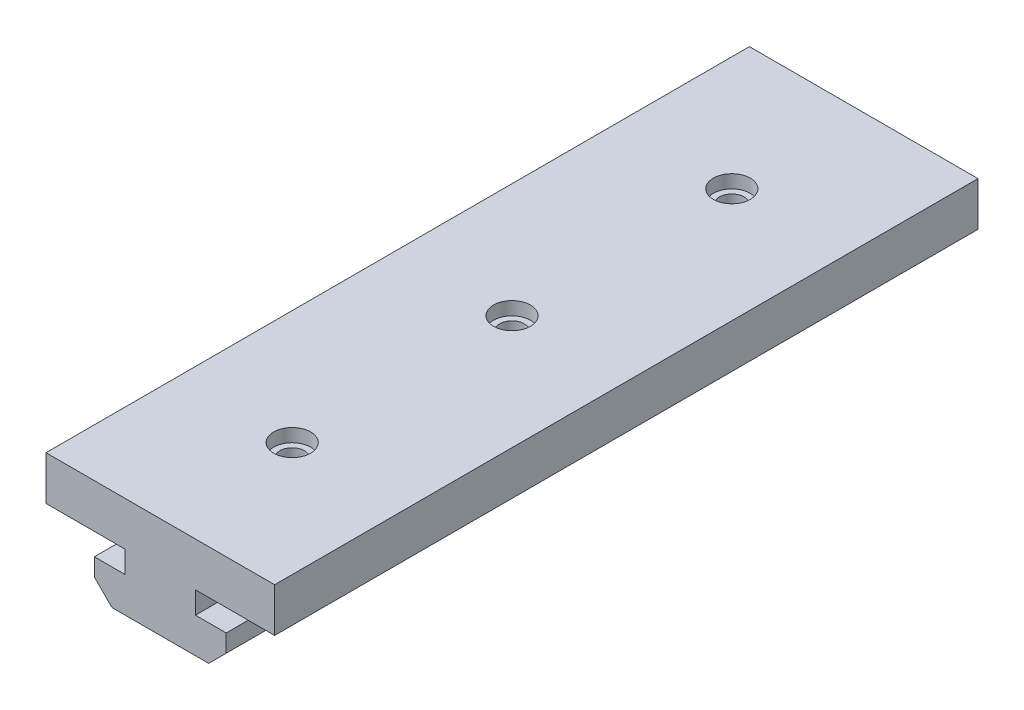
ISO-10303-21;
HEADER;
FILE_DESCRIPTION(('STEP AP214'),'2;1');
FILE_NAME('part.step','',(''),(''),'','','');
FILE_SCHEMA(('AUTOMOTIVE_DESIGN { 1 0 10303 214 1 1 1 1 }'));
ENDSEC;
DATA;
#1=APPLICATION_CONTEXT('core data for automotive mechanical design processes');
#2=APPLICATION_PROTOCOL_DEFINITION('international standard','automotive_design',2000,#1);
#3=PRODUCT_CONTEXT('',#1,'mechanical');
#4=PRODUCT('Part','Part','',(#3));
#5=PRODUCT_RELATED_PRODUCT_CATEGORY('part','',(#4));
#6=PRODUCT_DEFINITION_FORMATION('','',#4);
#7=PRODUCT_DEFINITION_CONTEXT('part definition',#1,'design');
#8=PRODUCT_DEFINITION('design','',#6,#7);
#9=PRODUCT_DEFINITION_SHAPE('','',#8);
#10=(LENGTH_UNIT() NAMED_UNIT(*) SI_UNIT(.MILLI.,.METRE.));
#11=(NAMED_UNIT(*) PLANE_ANGLE_UNIT() SI_UNIT($,.RADIAN.));
#12=(NAMED_UNIT(*) SI_UNIT($,.STERADIAN.) SOLID_ANGLE_UNIT());
#13=UNCERTAINTY_MEASURE_WITH_UNIT(LENGTH_MEASURE(1.E-05),#10,'distance_accuracy_value','');
#14=(GEOMETRIC_REPRESENTATION_CONTEXT(3) GLOBAL_UNCERTAINTY_ASSIGNED_CONTEXT((#13)) GLOBAL_UNIT_ASSIGNED_CONTEXT((#10,
#11,#12)) REPRESENTATION_CONTEXT('',''));
#15=CARTESIAN_POINT('',(0.,0.,0.));
#16=DIRECTION('',(0.,0.,1.));
#17=DIRECTION('',(1.,0.,0.));
#18=AXIS2_PLACEMENT_3D('',#15,#16,#17);
#19=CARTESIAN_POINT('',(-13.,5.,80.));
#20=DIRECTION('',(1.,0.,0.));
#21=DIRECTION('',(0.,0.,-1.));
#22=AXIS2_PLACEMENT_3D('',#19,#20,#21);
#23=PLANE('',#22);
#24=DIRECTION('',(0.,-1.,0.));
#25=VECTOR('',#24,1.);
#26=CARTESIAN_POINT('',(-13.,5.,0.));
#27=LINE('',#26,#25);
#28=CARTESIAN_POINT('',(-13.,5.,0.));
#29=VERTEX_POINT('',#28);
#30=CARTESIAN_POINT('',(-13.,0.,0.));
#31=VERTEX_POINT('',#30);
#32=EDGE_CURVE('E164',#29,#31,#27,.T.);
#33=ORIENTED_EDGE('',*,*,#32,.T.);
#34=DIRECTION('',(0.,0.,-1.));
#35=VECTOR('',#34,1.);
#36=CARTESIAN_POINT('',(-13.,0.,80.));
#37=LINE('',#36,#35);
#38=CARTESIAN_POINT('',(-13.,0.,80.));
#39=VERTEX_POINT('',#38);
#40=EDGE_CURVE('E11',#39,#31,#37,.T.);
#41=ORIENTED_EDGE('',*,*,#40,.F.);
#42=DIRECTION('',(0.,-1.,0.));
#43=VECTOR('',#42,1.);
#44=CARTESIAN_POINT('',(-13.,5.,80.));
#45=LINE('',#44,#43);
#46=CARTESIAN_POINT('',(-13.,5.,80.));
#47=VERTEX_POINT('',#46);
#48=EDGE_CURVE('E191',#47,#39,#45,.T.);
#49=ORIENTED_EDGE('',*,*,#48,.F.);
#50=DIRECTION('',(0.,0.,-1.));
#51=VECTOR('',#50,1.);
#52=CARTESIAN_POINT('',(-13.,5.,80.));
#53=LINE('',#52,#51);
#54=EDGE_CURVE('E160',#47,#29,#53,.T.);
#55=ORIENTED_EDGE('',*,*,#54,.T.);
#56=EDGE_LOOP('',(#33,#41,#49,#55));
#57=FACE_BOUND('',#56,.T.);
#58=ADVANCED_FACE('F32',(#57),#23,.F.);
#59=CARTESIAN_POINT('',(-13.,0.,80.));
#60=DIRECTION('',(0.,1.,0.));
#61=DIRECTION('',(0.,0.,1.));
#62=AXIS2_PLACEMENT_3D('',#59,#60,#61);
#63=PLANE('',#62);
#64=DIRECTION('',(1.,0.,0.));
#65=VECTOR('',#64,1.);
#66=CARTESIAN_POINT('',(-13.,0.,0.));
#67=LINE('',#66,#65);
#68=CARTESIAN_POINT('',(-4.,0.,0.));
#69=VERTEX_POINT('',#68);
#70=EDGE_CURVE('E167',#31,#69,#67,.T.);
#71=ORIENTED_EDGE('',*,*,#70,.T.);
#72=DIRECTION('',(0.,0.,-1.));
#73=VECTOR('',#72,1.);
#74=CARTESIAN_POINT('',(-4.,0.,80.));
#75=LINE('',#74,#73);
#76=CARTESIAN_POINT('',(-4.,0.,80.));
#77=VERTEX_POINT('',#76);
#78=EDGE_CURVE('E40',#77,#69,#75,.T.);
#79=ORIENTED_EDGE('',*,*,#78,.F.);
#80=DIRECTION('',(1.,0.,0.));
#81=VECTOR('',#80,1.);
#82=CARTESIAN_POINT('',(-13.,0.,80.));
#83=LINE('',#82,#81);
#84=EDGE_CURVE('E109',#39,#77,#83,.T.);
#85=ORIENTED_EDGE('',*,*,#84,.F.);
#86=ORIENTED_EDGE('',*,*,#40,.T.);
#87=EDGE_LOOP('',(#71,#79,#85,#86));
#88=FACE_BOUND('',#87,.T.);
#89=ADVANCED_FACE('F282',(#88),#63,.F.);
#90=CARTESIAN_POINT('',(-4.,0.,80.));
#91=DIRECTION('',(1.,0.,0.));
#92=DIRECTION('',(0.,0.,-1.));
#93=AXIS2_PLACEMENT_3D('',#90,#91,#92);
#94=PLANE('',#93);
#95=DIRECTION('',(0.,-1.,0.));
#96=VECTOR('',#95,1.);
#97=CARTESIAN_POINT('',(-4.,0.,0.));
#98=LINE('',#97,#96);
#99=CARTESIAN_POINT('',(-4.,-2.5,0.));
#100=VERTEX_POINT('',#99);
#101=EDGE_CURVE('E170',#69,#100,#98,.T.);
#102=ORIENTED_EDGE('',*,*,#101,.T.);
#103=DIRECTION('',(0.,0.,-1.));
#104=VECTOR('',#103,1.);
#105=CARTESIAN_POINT('',(-4.,-2.5,80.));
#106=LINE('',#105,#104);
#107=CARTESIAN_POINT('',(-4.,-2.5,80.));
#108=VERTEX_POINT('',#107);
#109=EDGE_CURVE('E216',#108,#100,#106,.T.);
#110=ORIENTED_EDGE('',*,*,#109,.F.);
#111=DIRECTION('',(0.,-1.,0.));
#112=VECTOR('',#111,1.);
#113=CARTESIAN_POINT('',(-4.,0.,80.));
#114=LINE('',#113,#112);
#115=EDGE_CURVE('E224',#77,#108,#114,.T.);
#116=ORIENTED_EDGE('',*,*,#115,.F.);
#117=ORIENTED_EDGE('',*,*,#78,.T.);
#118=EDGE_LOOP('',(#102,#110,#116,#117));
#119=FACE_BOUND('',#118,.T.);
#120=ADVANCED_FACE('F222',(#119),#94,.F.);
#121=CARTESIAN_POINT('',(-4.,-2.5,80.));
#122=DIRECTION('',(0.,-1.,0.));
#123=DIRECTION('',(0.,0.,-1.));
#124=AXIS2_PLACEMENT_3D('',#121,#122,#123);
#125=PLANE('',#124);
#126=DIRECTION('',(-1.,0.,0.));
#127=VECTOR('',#126,1.);
#128=CARTESIAN_POINT('',(-4.,-2.5,0.));
#129=LINE('',#128,#127);
#130=CARTESIAN_POINT('',(-7.5,-2.5,0.));
#131=VERTEX_POINT('',#130);
#132=EDGE_CURVE('E172',#100,#131,#129,.T.);
#133=ORIENTED_EDGE('',*,*,#132,.T.);
#134=DIRECTION('',(0.,0.,-1.));
#135=VECTOR('',#134,1.);
#136=CARTESIAN_POINT('',(-7.5,-2.5,80.));
#137=LINE('',#136,#135);
#138=CARTESIAN_POINT('',(-7.5,-2.5,80.));
#139=VERTEX_POINT('',#138);
#140=EDGE_CURVE('E213',#139,#131,#137,.T.);
#141=ORIENTED_EDGE('',*,*,#140,.F.);
#142=DIRECTION('',(-1.,0.,0.));
#143=VECTOR('',#142,1.);
#144=CARTESIAN_POINT('',(-4.,-2.5,80.));
#145=LINE('',#144,#143);
#146=EDGE_CURVE('E242',#108,#139,#145,.T.);
#147=ORIENTED_EDGE('',*,*,#146,.F.);
#148=ORIENTED_EDGE('',*,*,#109,.T.);
#149=EDGE_LOOP('',(#133,#141,#147,#148));
#150=FACE_BOUND('',#149,.T.);
#151=ADVANCED_FACE('F233',(#150),#125,.F.);
#152=CARTESIAN_POINT('',(-7.5,-2.5,80.));
#153=DIRECTION('',(1.,0.,0.));
#154=DIRECTION('',(0.,0.,-1.));
#155=AXIS2_PLACEMENT_3D('',#152,#153,#154);
#156=PLANE('',#155);
#157=DIRECTION('',(0.,-1.,0.));
#158=VECTOR('',#157,1.);
#159=CARTESIAN_POINT('',(-7.5,-2.5,0.));
#160=LINE('',#159,#158);
#161=CARTESIAN_POINT('',(-7.5,-4.5,0.));
#162=VERTEX_POINT('',#161);
#163=EDGE_CURVE('E174',#131,#162,#160,.T.);
#164=ORIENTED_EDGE('',*,*,#163,.T.);
#165=DIRECTION('',(0.,0.,-1.));
#166=VECTOR('',#165,1.);
#167=CARTESIAN_POINT('',(-7.5,-4.5,80.));
#168=LINE('',#167,#166);
#169=CARTESIAN_POINT('',(-7.5,-4.5,80.));
#170=VERTEX_POINT('',#169);
#171=EDGE_CURVE('E210',#170,#162,#168,.T.);
#172=ORIENTED_EDGE('',*,*,#171,.F.);
#173=DIRECTION('',(0.,-1.,0.));
#174=VECTOR('',#173,1.);
#175=CARTESIAN_POINT('',(-7.5,-2.5,80.));
#176=LINE('',#175,#174);
#177=EDGE_CURVE('E239',#139,#170,#176,.T.);
#178=ORIENTED_EDGE('',*,*,#177,.F.);
#179=ORIENTED_EDGE('',*,*,#140,.T.);
#180=EDGE_LOOP('',(#164,#172,#178,#179));
#181=FACE_BOUND('',#180,.T.);
#182=ADVANCED_FACE('F237',(#181),#156,.F.);
#183=CARTESIAN_POINT('',(-7.5,-4.5,80.));
#184=DIRECTION('',(0.707106781186548,0.707106781186548,0.));
#185=DIRECTION('',(-0.707106781186548,0.707106781186548,0.));
#186=AXIS2_PLACEMENT_3D('',#183,#184,#185);
#187=PLANE('',#186);
#188=DIRECTION('',(0.707106781186548,-0.707106781186548,0.));
#189=VECTOR('',#188,1.);
#190=CARTESIAN_POINT('',(-7.5,-4.5,0.));
#191=LINE('',#190,#189);
#192=CARTESIAN_POINT('',(-5.5,-6.5,0.));
#193=VERTEX_POINT('',#192);
#194=EDGE_CURVE('E176',#162,#193,#191,.T.);
#195=ORIENTED_EDGE('',*,*,#194,.T.);
#196=DIRECTION('',(0.,0.,-1.));
#197=VECTOR('',#196,1.);
#198=CARTESIAN_POINT('',(-5.5,-6.5,80.));
#199=LINE('',#198,#197);
#200=CARTESIAN_POINT('',(-5.5,-6.5,80.));
#201=VERTEX_POINT('',#200);
#202=EDGE_CURVE('E207',#201,#193,#199,.T.);
#203=ORIENTED_EDGE('',*,*,#202,.F.);
#204=DIRECTION('',(0.707106781186548,-0.707106781186548,0.));
#205=VECTOR('',#204,1.);
#206=CARTESIAN_POINT('',(-7.5,-4.5,80.));
#207=LINE('',#206,#205);
#208=EDGE_CURVE('E241',#170,#201,#207,.T.);
#209=ORIENTED_EDGE('',*,*,#208,.F.);
#210=ORIENTED_EDGE('',*,*,#171,.T.);
#211=EDGE_LOOP('',(#195,#203,#209,#210));
#212=FACE_BOUND('',#211,.T.);
#213=ADVANCED_FACE('F295',(#212),#187,.F.);
#214=CARTESIAN_POINT('',(-5.5,-6.5,80.));
#215=DIRECTION('',(0.,1.,0.));
#216=DIRECTION('',(0.,0.,1.));
#217=AXIS2_PLACEMENT_3D('',#214,#215,#216);
#218=PLANE('',#217);
#219=CARTESIAN_POINT('',(0.,-6.5,65.));
#220=DIRECTION('',(0.,1.,0.));
#221=DIRECTION('',(0.,0.,1.));
#222=AXIS2_PLACEMENT_3D('',#219,#220,#221);
#223=CIRCLE('',#222,2.1);
#224=CARTESIAN_POINT('',(0.,-6.5,67.1));
#225=VERTEX_POINT('',#224);
#226=EDGE_CURVE('E506',#225,#225,#223,.T.);
#227=ORIENTED_EDGE('',*,*,#226,.T.);
#228=EDGE_LOOP('',(#227));
#229=FACE_BOUND('',#228,.T.);
#230=CARTESIAN_POINT('',(0.,-6.5,40.));
#231=DIRECTION('',(0.,1.,0.));
#232=DIRECTION('',(0.,0.,1.));
#233=AXIS2_PLACEMENT_3D('',#230,#231,#232);
#234=CIRCLE('',#233,2.1);
#235=CARTESIAN_POINT('',(0.,-6.5,42.1));
#236=VERTEX_POINT('',#235);
#237=EDGE_CURVE('E525',#236,#236,#234,.T.);
#238=ORIENTED_EDGE('',*,*,#237,.T.);
#239=EDGE_LOOP('',(#238));
#240=FACE_BOUND('',#239,.T.);
#241=CARTESIAN_POINT('',(0.,-6.5,15.));
#242=DIRECTION('',(0.,1.,0.));
#243=DIRECTION('',(0.,0.,1.));
#244=AXIS2_PLACEMENT_3D('',#241,#242,#243);
#245=CIRCLE('',#244,2.1);
#246=CARTESIAN_POINT('',(0.,-6.5,17.1));
#247=VERTEX_POINT('',#246);
#248=EDGE_CURVE('E543',#247,#247,#245,.T.);
#249=ORIENTED_EDGE('',*,*,#248,.T.);
#250=EDGE_LOOP('',(#249));
#251=FACE_BOUND('',#250,.T.);
#252=DIRECTION('',(1.,0.,0.));
#253=VECTOR('',#252,1.);
#254=CARTESIAN_POINT('',(-5.5,-6.5,0.));
#255=LINE('',#254,#253);
#256=CARTESIAN_POINT('',(5.5,-6.5,0.));
#257=VERTEX_POINT('',#256);
#258=EDGE_CURVE('E178',#193,#257,#255,.T.);
#259=ORIENTED_EDGE('',*,*,#258,.T.);
#260=DIRECTION('',(0.,0.,-1.));
#261=VECTOR('',#260,1.);
#262=CARTESIAN_POINT('',(5.5,-6.5,80.));
#263=LINE('',#262,#261);
#264=CARTESIAN_POINT('',(5.5,-6.5,80.));
#265=VERTEX_POINT('',#264);
#266=EDGE_CURVE('E204',#265,#257,#263,.T.);
#267=ORIENTED_EDGE('',*,*,#266,.F.);
#268=DIRECTION('',(1.,0.,0.));
#269=VECTOR('',#268,1.);
#270=CARTESIAN_POINT('',(-5.5,-6.5,80.));
#271=LINE('',#270,#269);
#272=EDGE_CURVE('E244',#201,#265,#271,.T.);
#273=ORIENTED_EDGE('',*,*,#272,.F.);
#274=ORIENTED_EDGE('',*,*,#202,.T.);
#275=EDGE_LOOP('',(#259,#267,#273,#274));
#276=FACE_BOUND('',#275,.T.);
#277=ADVANCED_FACE('F298',(#229,#240,#251,#276),#218,.F.);
#278=CARTESIAN_POINT('',(5.5,-6.5,80.));
#279=DIRECTION('',(-0.707106781186548,0.707106781186548,0.));
#280=DIRECTION('',(-0.707106781186548,-0.707106781186548,0.));
#281=AXIS2_PLACEMENT_3D('',#278,#279,#280);
#282=PLANE('',#281);
#283=DIRECTION('',(0.707106781186548,0.707106781186548,0.));
#284=VECTOR('',#283,1.);
#285=CARTESIAN_POINT('',(5.5,-6.5,0.));
#286=LINE('',#285,#284);
#287=CARTESIAN_POINT('',(7.5,-4.5,0.));
#288=VERTEX_POINT('',#287);
#289=EDGE_CURVE('E180',#257,#288,#286,.T.);
#290=ORIENTED_EDGE('',*,*,#289,.T.);
#291=DIRECTION('',(0.,0.,-1.));
#292=VECTOR('',#291,1.);
#293=CARTESIAN_POINT('',(7.5,-4.5,80.));
#294=LINE('',#293,#292);
#295=CARTESIAN_POINT('',(7.5,-4.5,80.));
#296=VERTEX_POINT('',#295);
#297=EDGE_CURVE('E201',#296,#288,#294,.T.);
#298=ORIENTED_EDGE('',*,*,#297,.F.);
#299=DIRECTION('',(0.707106781186548,0.707106781186548,0.));
#300=VECTOR('',#299,1.);
#301=CARTESIAN_POINT('',(5.5,-6.5,80.));
#302=LINE('',#301,#300);
#303=EDGE_CURVE('E250',#265,#296,#302,.T.);
#304=ORIENTED_EDGE('',*,*,#303,.F.);
#305=ORIENTED_EDGE('',*,*,#266,.T.);
#306=EDGE_LOOP('',(#290,#298,#304,#305));
#307=FACE_BOUND('',#306,.T.);
#308=ADVANCED_FACE('F302',(#307),#282,.F.);
#309=CARTESIAN_POINT('',(7.5,-4.5,80.));
#310=DIRECTION('',(-1.,0.,0.));
#311=DIRECTION('',(0.,0.,1.));
#312=AXIS2_PLACEMENT_3D('',#309,#310,#311);
#313=PLANE('',#312);
#314=DIRECTION('',(0.,1.,0.));
#315=VECTOR('',#314,1.);
#316=CARTESIAN_POINT('',(7.5,-4.5,0.));
#317=LINE('',#316,#315);
#318=CARTESIAN_POINT('',(7.5,-2.5,0.));
#319=VERTEX_POINT('',#318);
#320=EDGE_CURVE('E182',#288,#319,#317,.T.);
#321=ORIENTED_EDGE('',*,*,#320,.T.);
#322=DIRECTION('',(0.,0.,-1.));
#323=VECTOR('',#322,1.);
#324=CARTESIAN_POINT('',(7.5,-2.5,80.));
#325=LINE('',#324,#323);
#326=CARTESIAN_POINT('',(7.5,-2.5,80.));
#327=VERTEX_POINT('',#326);
#328=EDGE_CURVE('E198',#327,#319,#325,.T.);
#329=ORIENTED_EDGE('',*,*,#328,.F.);
#330=DIRECTION('',(0.,1.,0.));
#331=VECTOR('',#330,1.);
#332=CARTESIAN_POINT('',(7.5,-4.5,80.));
#333=LINE('',#332,#331);
#334=EDGE_CURVE('E252',#296,#327,#333,.T.);
#335=ORIENTED_EDGE('',*,*,#334,.F.);
#336=ORIENTED_EDGE('',*,*,#297,.T.);
#337=EDGE_LOOP('',(#321,#329,#335,#336));
#338=FACE_BOUND('',#337,.T.);
#339=ADVANCED_FACE('F306',(#338),#313,.F.);
#340=CARTESIAN_POINT('',(7.5,-2.5,80.));
#341=DIRECTION('',(0.,-1.,0.));
#342=DIRECTION('',(0.,0.,-1.));
#343=AXIS2_PLACEMENT_3D('',#340,#341,#342);
#344=PLANE('',#343);
#345=DIRECTION('',(-1.,0.,0.));
#346=VECTOR('',#345,1.);
#347=CARTESIAN_POINT('',(7.5,-2.5,0.));
#348=LINE('',#347,#346);
#349=CARTESIAN_POINT('',(4.,-2.5,0.));
#350=VERTEX_POINT('',#349);
#351=EDGE_CURVE('E184',#319,#350,#348,.T.);
#352=ORIENTED_EDGE('',*,*,#351,.T.);
#353=DIRECTION('',(0.,0.,-1.));
#354=VECTOR('',#353,1.);
#355=CARTESIAN_POINT('',(4.,-2.5,80.));
#356=LINE('',#355,#354);
#357=CARTESIAN_POINT('',(4.,-2.5,80.));
#358=VERTEX_POINT('',#357);
#359=EDGE_CURVE('E195',#358,#350,#356,.T.);
#360=ORIENTED_EDGE('',*,*,#359,.F.);
#361=DIRECTION('',(-1.,0.,0.));
#362=VECTOR('',#361,1.);
#363=CARTESIAN_POINT('',(7.5,-2.5,80.));
#364=LINE('',#363,#362);
#365=EDGE_CURVE('E254',#327,#358,#364,.T.);
#366=ORIENTED_EDGE('',*,*,#365,.F.);
#367=ORIENTED_EDGE('',*,*,#328,.T.);
#368=EDGE_LOOP('',(#352,#360,#366,#367));
#369=FACE_BOUND('',#368,.T.);
#370=ADVANCED_FACE('F260',(#369),#344,.F.);
#371=CARTESIAN_POINT('',(4.,-2.5,80.));
#372=DIRECTION('',(-1.,0.,0.));
#373=DIRECTION('',(0.,0.,1.));
#374=AXIS2_PLACEMENT_3D('',#371,#372,#373);
#375=PLANE('',#374);
#376=DIRECTION('',(0.,1.,0.));
#377=VECTOR('',#376,1.);
#378=CARTESIAN_POINT('',(4.,-2.5,0.));
#379=LINE('',#378,#377);
#380=CARTESIAN_POINT('',(4.,0.,0.));
#381=VERTEX_POINT('',#380);
#382=EDGE_CURVE('E186',#350,#381,#379,.T.);
#383=ORIENTED_EDGE('',*,*,#382,.T.);
#384=DIRECTION('',(0.,0.,-1.));
#385=VECTOR('',#384,1.);
#386=CARTESIAN_POINT('',(4.,0.,80.));
#387=LINE('',#386,#385);
#388=CARTESIAN_POINT('',(4.,0.,80.));
#389=VERTEX_POINT('',#388);
#390=EDGE_CURVE('E155',#389,#381,#387,.T.);
#391=ORIENTED_EDGE('',*,*,#390,.F.);
#392=DIRECTION('',(0.,1.,0.));
#393=VECTOR('',#392,1.);
#394=CARTESIAN_POINT('',(4.,-2.5,80.));
#395=LINE('',#394,#393);
#396=EDGE_CURVE('E146',#358,#389,#395,.T.);
#397=ORIENTED_EDGE('',*,*,#396,.F.);
#398=ORIENTED_EDGE('',*,*,#359,.T.);
#399=EDGE_LOOP('',(#383,#391,#397,#398));
#400=FACE_BOUND('',#399,.T.);
#401=ADVANCED_FACE('F264',(#400),#375,.F.);
#402=CARTESIAN_POINT('',(4.,0.,80.));
#403=DIRECTION('',(0.,1.,0.));
#404=DIRECTION('',(0.,0.,1.));
#405=AXIS2_PLACEMENT_3D('',#402,#403,#404);
#406=PLANE('',#405);
#407=DIRECTION('',(1.,0.,0.));
#408=VECTOR('',#407,1.);
#409=CARTESIAN_POINT('',(4.,0.,0.));
#410=LINE('',#409,#408);
#411=CARTESIAN_POINT('',(13.,0.,0.));
#412=VERTEX_POINT('',#411);
#413=EDGE_CURVE('E154',#381,#412,#410,.T.);
#414=ORIENTED_EDGE('',*,*,#413,.T.);
#415=DIRECTION('',(0.,0.,-1.));
#416=VECTOR('',#415,1.);
#417=CARTESIAN_POINT('',(13.,0.,80.));
#418=LINE('',#417,#416);
#419=CARTESIAN_POINT('',(13.,0.,80.));
#420=VERTEX_POINT('',#419);
#421=EDGE_CURVE('E151',#420,#412,#418,.T.);
#422=ORIENTED_EDGE('',*,*,#421,.F.);
#423=DIRECTION('',(1.,0.,0.));
#424=VECTOR('',#423,1.);
#425=CARTESIAN_POINT('',(4.,0.,80.));
#426=LINE('',#425,#424);
#427=EDGE_CURVE('E140',#389,#420,#426,.T.);
#428=ORIENTED_EDGE('',*,*,#427,.F.);
#429=ORIENTED_EDGE('',*,*,#390,.T.);
#430=EDGE_LOOP('',(#414,#422,#428,#429));
#431=FACE_BOUND('',#430,.T.);
#432=ADVANCED_FACE('F152',(#431),#406,.F.);
#433=CARTESIAN_POINT('',(13.,0.,80.));
#434=DIRECTION('',(-1.,0.,0.));
#435=DIRECTION('',(0.,0.,1.));
#436=AXIS2_PLACEMENT_3D('',#433,#434,#435);
#437=PLANE('',#436);
#438=DIRECTION('',(0.,1.,0.));
#439=VECTOR('',#438,1.);
#440=CARTESIAN_POINT('',(13.,0.,0.));
#441=LINE('',#440,#439);
#442=CARTESIAN_POINT('',(13.,5.,0.));
#443=VERTEX_POINT('',#442);
#444=EDGE_CURVE('E95',#412,#443,#441,.T.);
#445=ORIENTED_EDGE('',*,*,#444,.T.);
#446=DIRECTION('',(0.,0.,-1.));
#447=VECTOR('',#446,1.);
#448=CARTESIAN_POINT('',(13.,5.,80.));
#449=LINE('',#448,#447);
#450=CARTESIAN_POINT('',(13.,5.,80.));
#451=VERTEX_POINT('',#450);
#452=EDGE_CURVE('E156',#451,#443,#449,.T.);
#453=ORIENTED_EDGE('',*,*,#452,.F.);
#454=DIRECTION('',(0.,1.,0.));
#455=VECTOR('',#454,1.);
#456=CARTESIAN_POINT('',(13.,0.,80.));
#457=LINE('',#456,#455);
#458=EDGE_CURVE('E144',#420,#451,#457,.T.);
#459=ORIENTED_EDGE('',*,*,#458,.F.);
#460=ORIENTED_EDGE('',*,*,#421,.T.);
#461=EDGE_LOOP('',(#445,#453,#459,#460));
#462=FACE_BOUND('',#461,.T.);
#463=ADVANCED_FACE('F158',(#462),#437,.F.);
#464=CARTESIAN_POINT('',(13.,5.,80.));
#465=DIRECTION('',(0.,-1.,0.));
#466=DIRECTION('',(0.,0.,-1.));
#467=AXIS2_PLACEMENT_3D('',#464,#465,#466);
#468=PLANE('',#467);
#469=CARTESIAN_POINT('',(0.,5.,65.));
#470=DIRECTION('',(0.,1.,0.));
#471=DIRECTION('',(0.,0.,1.));
#472=AXIS2_PLACEMENT_3D('',#469,#470,#471);
#473=CIRCLE('',#472,2.1);
#474=CARTESIAN_POINT('',(0.,5.,67.1));
#475=VERTEX_POINT('',#474);
#476=EDGE_CURVE('E522',#475,#475,#473,.T.);
#477=ORIENTED_EDGE('',*,*,#476,.F.);
#478=EDGE_LOOP('',(#477));
#479=FACE_BOUND('',#478,.T.);
#480=CARTESIAN_POINT('',(0.,5.,40.));
#481=DIRECTION('',(0.,1.,0.));
#482=DIRECTION('',(0.,0.,1.));
#483=AXIS2_PLACEMENT_3D('',#480,#481,#482);
#484=CIRCLE('',#483,2.1);
#485=CARTESIAN_POINT('',(0.,5.,42.1));
#486=VERTEX_POINT('',#485);
#487=EDGE_CURVE('E540',#486,#486,#484,.T.);
#488=ORIENTED_EDGE('',*,*,#487,.F.);
#489=EDGE_LOOP('',(#488));
#490=FACE_BOUND('',#489,.T.);
#491=CARTESIAN_POINT('',(0.,5.,15.));
#492=DIRECTION('',(0.,1.,0.));
#493=DIRECTION('',(0.,0.,1.));
#494=AXIS2_PLACEMENT_3D('',#491,#492,#493);
#495=CIRCLE('',#494,2.1);
#496=CARTESIAN_POINT('',(0.,5.,17.1));
#497=VERTEX_POINT('',#496);
#498=EDGE_CURVE('E168',#497,#497,#495,.T.);
#499=ORIENTED_EDGE('',*,*,#498,.F.);
#500=EDGE_LOOP('',(#499));
#501=FACE_BOUND('',#500,.T.);
#502=DIRECTION('',(-1.,0.,0.));
#503=VECTOR('',#502,1.);
#504=CARTESIAN_POINT('',(13.,5.,0.));
#505=LINE('',#504,#503);
#506=EDGE_CURVE('E101',#443,#29,#505,.T.);
#507=ORIENTED_EDGE('',*,*,#506,.T.);
#508=ORIENTED_EDGE('',*,*,#54,.F.);
#509=DIRECTION('',(-1.,0.,0.));
#510=VECTOR('',#509,1.);
#511=CARTESIAN_POINT('',(13.,5.,80.));
#512=LINE('',#511,#510);
#513=EDGE_CURVE('E48',#451,#47,#512,.T.);
#514=ORIENTED_EDGE('',*,*,#513,.F.);
#515=ORIENTED_EDGE('',*,*,#452,.T.);
#516=EDGE_LOOP('',(#507,#508,#514,#515));
#517=FACE_BOUND('',#516,.T.);
#518=ADVANCED_FACE('F268',(#479,#490,#501,#517),#468,.F.);
#519=CARTESIAN_POINT('',(-13.,0.,80.));
#520=DIRECTION('',(0.,0.,1.));
#521=DIRECTION('',(1.,0.,0.));
#522=AXIS2_PLACEMENT_3D('',#519,#520,#521);
#523=PLANE('',#522);
#524=ORIENTED_EDGE('',*,*,#48,.T.);
#525=ORIENTED_EDGE('',*,*,#84,.T.);
#526=ORIENTED_EDGE('',*,*,#115,.T.);
#527=ORIENTED_EDGE('',*,*,#146,.T.);
#528=ORIENTED_EDGE('',*,*,#177,.T.);
#529=ORIENTED_EDGE('',*,*,#208,.T.);
#530=ORIENTED_EDGE('',*,*,#272,.T.);
#531=ORIENTED_EDGE('',*,*,#303,.T.);
#532=ORIENTED_EDGE('',*,*,#334,.T.);
#533=ORIENTED_EDGE('',*,*,#365,.T.);
#534=ORIENTED_EDGE('',*,*,#396,.T.);
#535=ORIENTED_EDGE('',*,*,#427,.T.);
#536=ORIENTED_EDGE('',*,*,#458,.T.);
#537=ORIENTED_EDGE('',*,*,#513,.T.);
#538=EDGE_LOOP('',(#524,#525,#526,#527,#528,#529,#530,#531,#532,#533,#534,#535,#536,#537));
#539=FACE_BOUND('',#538,.T.);
#540=ADVANCED_FACE('F142',(#539),#523,.T.);
#541=CARTESIAN_POINT('',(-13.,0.,0.));
#542=DIRECTION('',(0.,0.,1.));
#543=DIRECTION('',(1.,0.,0.));
#544=AXIS2_PLACEMENT_3D('',#541,#542,#543);
#545=PLANE('',#544);
#546=ORIENTED_EDGE('',*,*,#32,.F.);
#547=ORIENTED_EDGE('',*,*,#506,.F.);
#548=ORIENTED_EDGE('',*,*,#444,.F.);
#549=ORIENTED_EDGE('',*,*,#413,.F.);
#550=ORIENTED_EDGE('',*,*,#382,.F.);
#551=ORIENTED_EDGE('',*,*,#351,.F.);
#552=ORIENTED_EDGE('',*,*,#320,.F.);
#553=ORIENTED_EDGE('',*,*,#289,.F.);
#554=ORIENTED_EDGE('',*,*,#258,.F.);
#555=ORIENTED_EDGE('',*,*,#194,.F.);
#556=ORIENTED_EDGE('',*,*,#163,.F.);
#557=ORIENTED_EDGE('',*,*,#132,.F.);
#558=ORIENTED_EDGE('',*,*,#101,.F.);
#559=ORIENTED_EDGE('',*,*,#70,.F.);
#560=EDGE_LOOP('',(#546,#547,#548,#549,#550,#551,#552,#553,#554,#555,#556,#557,#558,#559));
#561=FACE_BOUND('',#560,.T.);
#562=ADVANCED_FACE('F228',(#561),#545,.F.);
#563=CARTESIAN_POINT('',(0.,5.,15.));
#564=DIRECTION('',(0.,1.,0.));
#565=DIRECTION('',(0.,0.,1.));
#566=AXIS2_PLACEMENT_3D('',#563,#564,#565);
#567=CYLINDRICAL_SURFACE('',#566,2.1);
#568=CARTESIAN_POINT('',(0.,3.5,15.));
#569=DIRECTION('',(0.,1.,0.));
#570=DIRECTION('',(0.,0.,1.));
#571=AXIS2_PLACEMENT_3D('',#568,#569,#570);
#572=CIRCLE('',#571,2.1);
#573=CARTESIAN_POINT('',(0.,3.5,17.1));
#574=VERTEX_POINT('',#573);
#575=EDGE_CURVE('E555',#574,#574,#572,.T.);
#576=ORIENTED_EDGE('',*,*,#575,.F.);
#577=EDGE_LOOP('',(#576));
#578=FACE_BOUND('',#577,.T.);
#579=ORIENTED_EDGE('',*,*,#498,.T.);
#580=EDGE_LOOP('',(#579));
#581=FACE_BOUND('',#580,.T.);
#582=ADVANCED_FACE('F340',(#578,#581),#567,.F.);
#583=CARTESIAN_POINT('',(1.4,3.5,15.));
#584=DIRECTION('',(0.,-1.,0.));
#585=DIRECTION('',(0.,0.,-1.));
#586=AXIS2_PLACEMENT_3D('',#583,#584,#585);
#587=PLANE('',#586);
#588=CARTESIAN_POINT('',(0.,3.5,15.));
#589=DIRECTION('',(0.,1.,0.));
#590=DIRECTION('',(0.,0.,1.));
#591=AXIS2_PLACEMENT_3D('',#588,#589,#590);
#592=CIRCLE('',#591,1.4);
#593=CARTESIAN_POINT('',(0.,3.5,16.4));
#594=VERTEX_POINT('',#593);
#595=EDGE_CURVE('E552',#594,#594,#592,.T.);
#596=ORIENTED_EDGE('',*,*,#595,.F.);
#597=EDGE_LOOP('',(#596));
#598=FACE_BOUND('',#597,.T.);
#599=ORIENTED_EDGE('',*,*,#575,.T.);
#600=EDGE_LOOP('',(#599));
#601=FACE_BOUND('',#600,.T.);
#602=ADVANCED_FACE('F359',(#598,#601),#587,.F.);
#603=CARTESIAN_POINT('',(0.,5.,15.));
#604=DIRECTION('',(0.,1.,0.));
#605=DIRECTION('',(0.,0.,1.));
#606=AXIS2_PLACEMENT_3D('',#603,#604,#605);
#607=CYLINDRICAL_SURFACE('',#606,1.4);
#608=CARTESIAN_POINT('',(0.,-5.,15.));
#609=DIRECTION('',(0.,1.,0.));
#610=DIRECTION('',(0.,0.,1.));
#611=AXIS2_PLACEMENT_3D('',#608,#609,#610);
#612=CIRCLE('',#611,1.4);
#613=CARTESIAN_POINT('',(0.,-5.,16.4));
#614=VERTEX_POINT('',#613);
#615=EDGE_CURVE('E549',#614,#614,#612,.T.);
#616=ORIENTED_EDGE('',*,*,#615,.F.);
#617=EDGE_LOOP('',(#616));
#618=FACE_BOUND('',#617,.T.);
#619=ORIENTED_EDGE('',*,*,#595,.T.);
#620=EDGE_LOOP('',(#619));
#621=FACE_BOUND('',#620,.T.);
#622=ADVANCED_FACE('F369',(#618,#621),#607,.F.);
#623=CARTESIAN_POINT('',(1.4,-5.,15.));
#624=DIRECTION('',(0.,1.,0.));
#625=DIRECTION('',(0.,0.,1.));
#626=AXIS2_PLACEMENT_3D('',#623,#624,#625);
#627=PLANE('',#626);
#628=CARTESIAN_POINT('',(0.,-5.,15.));
#629=DIRECTION('',(0.,1.,0.));
#630=DIRECTION('',(0.,0.,1.));
#631=AXIS2_PLACEMENT_3D('',#628,#629,#630);
#632=CIRCLE('',#631,2.1);
#633=CARTESIAN_POINT('',(0.,-5.,17.1));
#634=VERTEX_POINT('',#633);
#635=EDGE_CURVE('E546',#634,#634,#632,.T.);
#636=ORIENTED_EDGE('',*,*,#635,.F.);
#637=EDGE_LOOP('',(#636));
#638=FACE_BOUND('',#637,.T.);
#639=ORIENTED_EDGE('',*,*,#615,.T.);
#640=EDGE_LOOP('',(#639));
#641=FACE_BOUND('',#640,.T.);
#642=ADVANCED_FACE('F379',(#638,#641),#627,.F.);
#643=CARTESIAN_POINT('',(0.,5.,15.));
#644=DIRECTION('',(0.,1.,0.));
#645=DIRECTION('',(0.,0.,1.));
#646=AXIS2_PLACEMENT_3D('',#643,#644,#645);
#647=CYLINDRICAL_SURFACE('',#646,2.1);
#648=ORIENTED_EDGE('',*,*,#248,.F.);
#649=EDGE_LOOP('',(#648));
#650=FACE_BOUND('',#649,.T.);
#651=ORIENTED_EDGE('',*,*,#635,.T.);
#652=EDGE_LOOP('',(#651));
#653=FACE_BOUND('',#652,.T.);
#654=ADVANCED_FACE('F389',(#650,#653),#647,.F.);
#655=CARTESIAN_POINT('',(0.,5.,40.));
#656=DIRECTION('',(0.,1.,0.));
#657=DIRECTION('',(0.,0.,1.));
#658=AXIS2_PLACEMENT_3D('',#655,#656,#657);
#659=CYLINDRICAL_SURFACE('',#658,2.1);
#660=CARTESIAN_POINT('',(0.,3.5,40.));
#661=DIRECTION('',(0.,1.,0.));
#662=DIRECTION('',(0.,0.,1.));
#663=AXIS2_PLACEMENT_3D('',#660,#661,#662);
#664=CIRCLE('',#663,2.1);
#665=CARTESIAN_POINT('',(0.,3.5,42.1));
#666=VERTEX_POINT('',#665);
#667=EDGE_CURVE('E537',#666,#666,#664,.T.);
#668=ORIENTED_EDGE('',*,*,#667,.F.);
#669=EDGE_LOOP('',(#668));
#670=FACE_BOUND('',#669,.T.);
#671=ORIENTED_EDGE('',*,*,#487,.T.);
#672=EDGE_LOOP('',(#671));
#673=FACE_BOUND('',#672,.T.);
#674=ADVANCED_FACE('F399',(#670,#673),#659,.F.);
#675=CARTESIAN_POINT('',(1.4,3.5,40.));
#676=DIRECTION('',(0.,-1.,0.));
#677=DIRECTION('',(0.,0.,-1.));
#678=AXIS2_PLACEMENT_3D('',#675,#676,#677);
#679=PLANE('',#678);
#680=CARTESIAN_POINT('',(0.,3.5,40.));
#681=DIRECTION('',(0.,1.,0.));
#682=DIRECTION('',(0.,0.,1.));
#683=AXIS2_PLACEMENT_3D('',#680,#681,#682);
#684=CIRCLE('',#683,1.4);
#685=CARTESIAN_POINT('',(0.,3.5,41.4));
#686=VERTEX_POINT('',#685);
#687=EDGE_CURVE('E534',#686,#686,#684,.T.);
#688=ORIENTED_EDGE('',*,*,#687,.F.);
#689=EDGE_LOOP('',(#688));
#690=FACE_BOUND('',#689,.T.);
#691=ORIENTED_EDGE('',*,*,#667,.T.);
#692=EDGE_LOOP('',(#691));
#693=FACE_BOUND('',#692,.T.);
#694=ADVANCED_FACE('F409',(#690,#693),#679,.F.);
#695=CARTESIAN_POINT('',(0.,5.,40.));
#696=DIRECTION('',(0.,1.,0.));
#697=DIRECTION('',(0.,0.,1.));
#698=AXIS2_PLACEMENT_3D('',#695,#696,#697);
#699=CYLINDRICAL_SURFACE('',#698,1.4);
#700=CARTESIAN_POINT('',(0.,-5.,40.));
#701=DIRECTION('',(0.,1.,0.));
#702=DIRECTION('',(0.,0.,1.));
#703=AXIS2_PLACEMENT_3D('',#700,#701,#702);
#704=CIRCLE('',#703,1.4);
#705=CARTESIAN_POINT('',(0.,-5.,41.4));
#706=VERTEX_POINT('',#705);
#707=EDGE_CURVE('E531',#706,#706,#704,.T.);
#708=ORIENTED_EDGE('',*,*,#707,.F.);
#709=EDGE_LOOP('',(#708));
#710=FACE_BOUND('',#709,.T.);
#711=ORIENTED_EDGE('',*,*,#687,.T.);
#712=EDGE_LOOP('',(#711));
#713=FACE_BOUND('',#712,.T.);
#714=ADVANCED_FACE('F419',(#710,#713),#699,.F.);
#715=CARTESIAN_POINT('',(1.4,-5.,40.));
#716=DIRECTION('',(0.,1.,0.));
#717=DIRECTION('',(0.,0.,1.));
#718=AXIS2_PLACEMENT_3D('',#715,#716,#717);
#719=PLANE('',#718);
#720=CARTESIAN_POINT('',(0.,-5.,40.));
#721=DIRECTION('',(0.,1.,0.));
#722=DIRECTION('',(0.,0.,1.));
#723=AXIS2_PLACEMENT_3D('',#720,#721,#722);
#724=CIRCLE('',#723,2.1);
#725=CARTESIAN_POINT('',(0.,-5.,42.1));
#726=VERTEX_POINT('',#725);
#727=EDGE_CURVE('E528',#726,#726,#724,.T.);
#728=ORIENTED_EDGE('',*,*,#727,.F.);
#729=EDGE_LOOP('',(#728));
#730=FACE_BOUND('',#729,.T.);
#731=ORIENTED_EDGE('',*,*,#707,.T.);
#732=EDGE_LOOP('',(#731));
#733=FACE_BOUND('',#732,.T.);
#734=ADVANCED_FACE('F429',(#730,#733),#719,.F.);
#735=CARTESIAN_POINT('',(0.,5.,40.));
#736=DIRECTION('',(0.,1.,0.));
#737=DIRECTION('',(0.,0.,1.));
#738=AXIS2_PLACEMENT_3D('',#735,#736,#737);
#739=CYLINDRICAL_SURFACE('',#738,2.1);
#740=ORIENTED_EDGE('',*,*,#237,.F.);
#741=EDGE_LOOP('',(#740));
#742=FACE_BOUND('',#741,.T.);
#743=ORIENTED_EDGE('',*,*,#727,.T.);
#744=EDGE_LOOP('',(#743));
#745=FACE_BOUND('',#744,.T.);
#746=ADVANCED_FACE('F439',(#742,#745),#739,.F.);
#747=CARTESIAN_POINT('',(0.,5.,65.));
#748=DIRECTION('',(0.,1.,0.));
#749=DIRECTION('',(0.,0.,1.));
#750=AXIS2_PLACEMENT_3D('',#747,#748,#749);
#751=CYLINDRICAL_SURFACE('',#750,2.1);
#752=CARTESIAN_POINT('',(0.,3.5,65.));
#753=DIRECTION('',(0.,1.,0.));
#754=DIRECTION('',(0.,0.,1.));
#755=AXIS2_PLACEMENT_3D('',#752,#753,#754);
#756=CIRCLE('',#755,2.1);
#757=CARTESIAN_POINT('',(0.,3.5,67.1));
#758=VERTEX_POINT('',#757);
#759=EDGE_CURVE('E519',#758,#758,#756,.T.);
#760=ORIENTED_EDGE('',*,*,#759,.F.);
#761=EDGE_LOOP('',(#760));
#762=FACE_BOUND('',#761,.T.);
#763=ORIENTED_EDGE('',*,*,#476,.T.);
#764=EDGE_LOOP('',(#763));
#765=FACE_BOUND('',#764,.T.);
#766=ADVANCED_FACE('F449',(#762,#765),#751,.F.);
#767=CARTESIAN_POINT('',(1.4,3.5,65.));
#768=DIRECTION('',(0.,-1.,0.));
#769=DIRECTION('',(0.,0.,-1.));
#770=AXIS2_PLACEMENT_3D('',#767,#768,#769);
#771=PLANE('',#770);
#772=CARTESIAN_POINT('',(0.,3.5,65.));
#773=DIRECTION('',(0.,1.,0.));
#774=DIRECTION('',(0.,0.,1.));
#775=AXIS2_PLACEMENT_3D('',#772,#773,#774);
#776=CIRCLE('',#775,1.4);
#777=CARTESIAN_POINT('',(0.,3.5,66.4));
#778=VERTEX_POINT('',#777);
#779=EDGE_CURVE('E513',#778,#778,#776,.T.);
#780=ORIENTED_EDGE('',*,*,#779,.F.);
#781=EDGE_LOOP('',(#780));
#782=FACE_BOUND('',#781,.T.);
#783=ORIENTED_EDGE('',*,*,#759,.T.);
#784=EDGE_LOOP('',(#783));
#785=FACE_BOUND('',#784,.T.);
#786=ADVANCED_FACE('F459',(#782,#785),#771,.F.);
#787=CARTESIAN_POINT('',(0.,5.,65.));
#788=DIRECTION('',(0.,1.,0.));
#789=DIRECTION('',(0.,0.,1.));
#790=AXIS2_PLACEMENT_3D('',#787,#788,#789);
#791=CYLINDRICAL_SURFACE('',#790,1.4);
#792=CARTESIAN_POINT('',(0.,-5.,65.));
#793=DIRECTION('',(0.,1.,0.));
#794=DIRECTION('',(0.,0.,1.));
#795=AXIS2_PLACEMENT_3D('',#792,#793,#794);
#796=CIRCLE('',#795,1.4);
#797=CARTESIAN_POINT('',(0.,-5.,66.4));
#798=VERTEX_POINT('',#797);
#799=EDGE_CURVE('E510',#798,#798,#796,.T.);
#800=ORIENTED_EDGE('',*,*,#799,.F.);
#801=EDGE_LOOP('',(#800));
#802=FACE_BOUND('',#801,.T.);
#803=ORIENTED_EDGE('',*,*,#779,.T.);
#804=EDGE_LOOP('',(#803));
#805=FACE_BOUND('',#804,.T.);
#806=ADVANCED_FACE('F469',(#802,#805),#791,.F.);
#807=CARTESIAN_POINT('',(1.4,-5.,65.));
#808=DIRECTION('',(0.,1.,0.));
#809=DIRECTION('',(0.,0.,1.));
#810=AXIS2_PLACEMENT_3D('',#807,#808,#809);
#811=PLANE('',#810);
#812=CARTESIAN_POINT('',(0.,-5.,65.));
#813=DIRECTION('',(0.,1.,0.));
#814=DIRECTION('',(0.,0.,1.));
#815=AXIS2_PLACEMENT_3D('',#812,#813,#814);
#816=CIRCLE('',#815,2.1);
#817=CARTESIAN_POINT('',(0.,-5.,67.1));
#818=VERTEX_POINT('',#817);
#819=EDGE_CURVE('E509',#818,#818,#816,.T.);
#820=ORIENTED_EDGE('',*,*,#819,.F.);
#821=EDGE_LOOP('',(#820));
#822=FACE_BOUND('',#821,.T.);
#823=ORIENTED_EDGE('',*,*,#799,.T.);
#824=EDGE_LOOP('',(#823));
#825=FACE_BOUND('',#824,.T.);
#826=ADVANCED_FACE('F479',(#822,#825),#811,.F.);
#827=CARTESIAN_POINT('',(0.,5.,65.));
#828=DIRECTION('',(0.,1.,0.));
#829=DIRECTION('',(0.,0.,1.));
#830=AXIS2_PLACEMENT_3D('',#827,#828,#829);
#831=CYLINDRICAL_SURFACE('',#830,2.1);
#832=ORIENTED_EDGE('',*,*,#226,.F.);
#833=EDGE_LOOP('',(#832));
#834=FACE_BOUND('',#833,.T.);
#835=ORIENTED_EDGE('',*,*,#819,.T.);
#836=EDGE_LOOP('',(#835));
#837=FACE_BOUND('',#836,.T.);
#838=ADVANCED_FACE('F489',(#834,#837),#831,.F.);
#839=CLOSED_SHELL('',(#58,#89,#120,#151,#182,#213,#277,#308,#339,#370,#401,#432,#463,#518,#540,
#562,#582,#602,#622,#642,#654,#674,#694,#714,#734,#746,#766,#786,#806,#826,#838));
#840=MANIFOLD_SOLID_BREP('B2',#839);
#841=ADVANCED_BREP_SHAPE_REPRESENTATION('',(#18,#840),#14);
#842=SHAPE_DEFINITION_REPRESENTATION(#9,#841);
ENDSEC;
END-ISO-10303-21;
